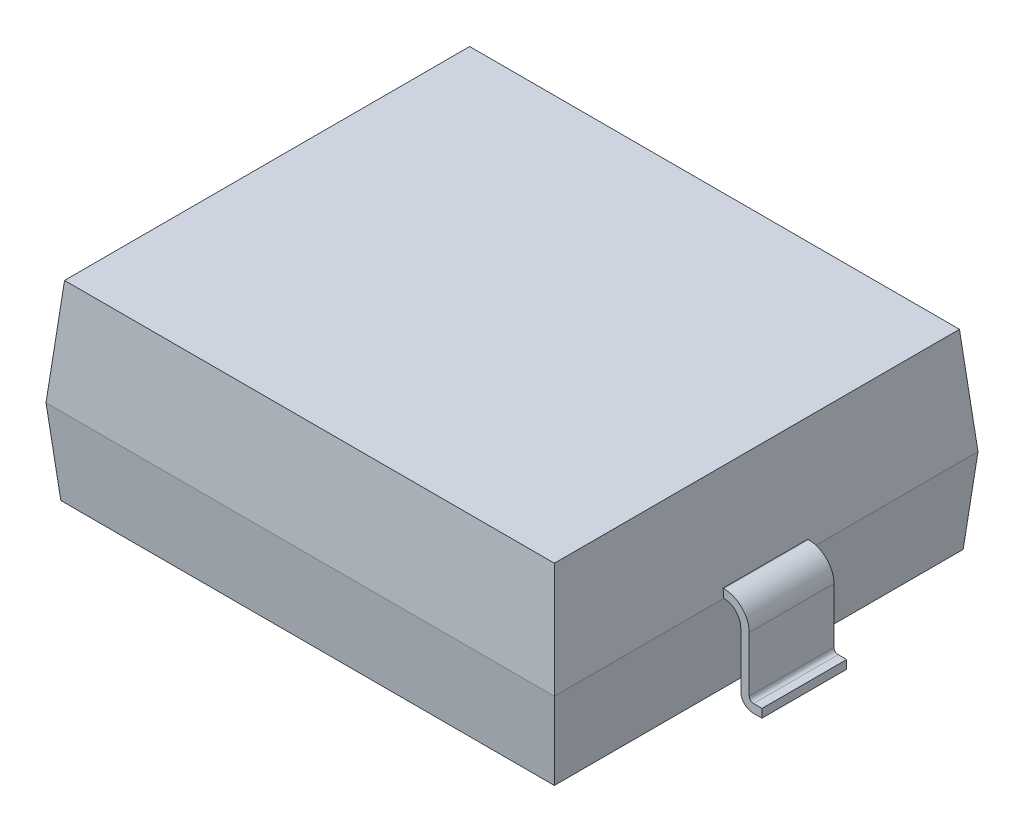
ISO-10303-21;
HEADER;
FILE_DESCRIPTION(('STEP AP214'),'2;1');
FILE_NAME('part.step','',(''),(''),'','','');
FILE_SCHEMA(('AUTOMOTIVE_DESIGN { 1 0 10303 214 1 1 1 1 }'));
ENDSEC;
DATA;
#1=APPLICATION_CONTEXT('core data for automotive mechanical design processes');
#2=APPLICATION_PROTOCOL_DEFINITION('international standard','automotive_design',2000,#1);
#3=PRODUCT_CONTEXT('',#1,'mechanical');
#4=PRODUCT('Part','Part','',(#3));
#5=PRODUCT_RELATED_PRODUCT_CATEGORY('part','',(#4));
#6=PRODUCT_DEFINITION_FORMATION('','',#4);
#7=PRODUCT_DEFINITION_CONTEXT('part definition',#1,'design');
#8=PRODUCT_DEFINITION('design','',#6,#7);
#9=PRODUCT_DEFINITION_SHAPE('','',#8);
#10=(LENGTH_UNIT() NAMED_UNIT(*) SI_UNIT(.MILLI.,.METRE.));
#11=(NAMED_UNIT(*) PLANE_ANGLE_UNIT() SI_UNIT($,.RADIAN.));
#12=(NAMED_UNIT(*) SI_UNIT($,.STERADIAN.) SOLID_ANGLE_UNIT());
#13=UNCERTAINTY_MEASURE_WITH_UNIT(LENGTH_MEASURE(1.E-05),#10,'distance_accuracy_value','');
#14=(GEOMETRIC_REPRESENTATION_CONTEXT(3) GLOBAL_UNCERTAINTY_ASSIGNED_CONTEXT((#13)) GLOBAL_UNIT_ASSIGNED_CONTEXT((#10,
#11,#12)) REPRESENTATION_CONTEXT('',''));
#15=CARTESIAN_POINT('',(0.,0.,0.));
#16=DIRECTION('',(0.,0.,1.));
#17=DIRECTION('',(1.,0.,0.));
#18=AXIS2_PLACEMENT_3D('',#15,#16,#17);
#19=CARTESIAN_POINT('',(3.,0.,-0.5));
#20=DIRECTION('',(0.,-1.,0.));
#21=DIRECTION('',(0.,0.,-1.));
#22=AXIS2_PLACEMENT_3D('',#19,#20,#21);
#23=PLANE('',#22);
#24=DIRECTION('',(0.,0.,1.));
#25=VECTOR('',#24,1.);
#26=CARTESIAN_POINT('',(1.57301780245438,0.,-0.5));
#27=LINE('',#26,#25);
#28=CARTESIAN_POINT('',(1.57301780245438,0.,-0.5));
#29=VERTEX_POINT('',#28);
#30=CARTESIAN_POINT('',(1.57301780245438,0.,0.5));
#31=VERTEX_POINT('',#30);
#32=EDGE_CURVE('E53',#29,#31,#27,.T.);
#33=ORIENTED_EDGE('',*,*,#32,.F.);
#34=DIRECTION('',(-1.,0.,0.));
#35=VECTOR('',#34,1.);
#36=CARTESIAN_POINT('',(3.,0.,-0.5));
#37=LINE('',#36,#35);
#38=CARTESIAN_POINT('',(3.,0.,-0.5));
#39=VERTEX_POINT('',#38);
#40=EDGE_CURVE('E223',#39,#29,#37,.T.);
#41=ORIENTED_EDGE('',*,*,#40,.F.);
#42=DIRECTION('',(0.,0.,1.));
#43=VECTOR('',#42,1.);
#44=CARTESIAN_POINT('',(3.,0.,-0.5));
#45=LINE('',#44,#43);
#46=CARTESIAN_POINT('',(3.,0.,0.5));
#47=VERTEX_POINT('',#46);
#48=EDGE_CURVE('E12',#39,#47,#45,.T.);
#49=ORIENTED_EDGE('',*,*,#48,.T.);
#50=DIRECTION('',(-1.,0.,0.));
#51=VECTOR('',#50,1.);
#52=CARTESIAN_POINT('',(3.,0.,0.5));
#53=LINE('',#52,#51);
#54=EDGE_CURVE('E144',#47,#31,#53,.T.);
#55=ORIENTED_EDGE('',*,*,#54,.T.);
#56=EDGE_LOOP('',(#33,#41,#49,#55));
#57=FACE_BOUND('',#56,.T.);
#58=ADVANCED_FACE('F50',(#57),#23,.T.);
#59=CARTESIAN_POINT('',(3.,-0.2,-0.5));
#60=DIRECTION('',(0.,0.,1.));
#61=DIRECTION('',(-1.,0.,0.));
#62=AXIS2_PLACEMENT_3D('',#59,#60,#61);
#63=CYLINDRICAL_SURFACE('',#62,0.2);
#64=ORIENTED_EDGE('',*,*,#48,.F.);
#65=CARTESIAN_POINT('',(3.,-0.2,-0.5));
#66=DIRECTION('',(0.,0.,1.));
#67=DIRECTION('',(-1.,0.,0.));
#68=AXIS2_PLACEMENT_3D('',#65,#66,#67);
#69=CIRCLE('',#68,0.2);
#70=CARTESIAN_POINT('',(3.2,-0.2,-0.5));
#71=VERTEX_POINT('',#70);
#72=EDGE_CURVE('E66',#71,#39,#69,.T.);
#73=ORIENTED_EDGE('',*,*,#72,.F.);
#74=DIRECTION('',(0.,0.,1.));
#75=VECTOR('',#74,1.);
#76=CARTESIAN_POINT('',(3.2,-0.2,-0.5));
#77=LINE('',#76,#75);
#78=CARTESIAN_POINT('',(3.2,-0.2,0.5));
#79=VERTEX_POINT('',#78);
#80=EDGE_CURVE('E58',#71,#79,#77,.T.);
#81=ORIENTED_EDGE('',*,*,#80,.T.);
#82=CARTESIAN_POINT('',(3.,-0.2,0.5));
#83=DIRECTION('',(0.,0.,1.));
#84=DIRECTION('',(-1.,0.,0.));
#85=AXIS2_PLACEMENT_3D('',#82,#83,#84);
#86=CIRCLE('',#85,0.2);
#87=EDGE_CURVE('E221',#79,#47,#86,.T.);
#88=ORIENTED_EDGE('',*,*,#87,.T.);
#89=EDGE_LOOP('',(#64,#73,#81,#88));
#90=FACE_BOUND('',#89,.T.);
#91=ADVANCED_FACE('F253',(#90),#63,.F.);
#92=CARTESIAN_POINT('',(3.2,-0.2,-0.5));
#93=DIRECTION('',(-1.,0.,0.));
#94=DIRECTION('',(0.,0.,-1.));
#95=AXIS2_PLACEMENT_3D('',#92,#93,#94);
#96=PLANE('',#95);
#97=ORIENTED_EDGE('',*,*,#80,.F.);
#98=DIRECTION('',(0.,1.,0.));
#99=VECTOR('',#98,1.);
#100=CARTESIAN_POINT('',(3.2,-0.2,-0.5));
#101=LINE('',#100,#99);
#102=CARTESIAN_POINT('',(3.2,-0.85,-0.5));
#103=VERTEX_POINT('',#102);
#104=EDGE_CURVE('E71',#103,#71,#101,.T.);
#105=ORIENTED_EDGE('',*,*,#104,.F.);
#106=DIRECTION('',(0.,0.,1.));
#107=VECTOR('',#106,1.);
#108=CARTESIAN_POINT('',(3.2,-0.85,-0.5));
#109=LINE('',#108,#107);
#110=CARTESIAN_POINT('',(3.2,-0.85,0.5));
#111=VERTEX_POINT('',#110);
#112=EDGE_CURVE('E167',#103,#111,#109,.T.);
#113=ORIENTED_EDGE('',*,*,#112,.T.);
#114=DIRECTION('',(0.,1.,0.));
#115=VECTOR('',#114,1.);
#116=CARTESIAN_POINT('',(3.2,-0.2,0.5));
#117=LINE('',#116,#115);
#118=EDGE_CURVE('E219',#111,#79,#117,.T.);
#119=ORIENTED_EDGE('',*,*,#118,.T.);
#120=EDGE_LOOP('',(#97,#105,#113,#119));
#121=FACE_BOUND('',#120,.T.);
#122=ADVANCED_FACE('F251',(#121),#96,.T.);
#123=CARTESIAN_POINT('',(3.35,-0.85,-0.5));
#124=DIRECTION('',(0.,0.,1.));
#125=DIRECTION('',(-1.,0.,0.));
#126=AXIS2_PLACEMENT_3D('',#123,#124,#125);
#127=CYLINDRICAL_SURFACE('',#126,0.15);
#128=ORIENTED_EDGE('',*,*,#112,.F.);
#129=CARTESIAN_POINT('',(3.35,-0.85,-0.5));
#130=DIRECTION('',(0.,0.,-1.));
#131=DIRECTION('',(1.,0.,0.));
#132=AXIS2_PLACEMENT_3D('',#129,#130,#131);
#133=CIRCLE('',#132,0.15);
#134=CARTESIAN_POINT('',(3.35,-1.,-0.5));
#135=VERTEX_POINT('',#134);
#136=EDGE_CURVE('E161',#135,#103,#133,.T.);
#137=ORIENTED_EDGE('',*,*,#136,.F.);
#138=DIRECTION('',(0.,0.,1.));
#139=VECTOR('',#138,1.);
#140=CARTESIAN_POINT('',(3.35,-1.,-0.5));
#141=LINE('',#140,#139);
#142=CARTESIAN_POINT('',(3.35,-1.,0.5));
#143=VERTEX_POINT('',#142);
#144=EDGE_CURVE('E170',#135,#143,#141,.T.);
#145=ORIENTED_EDGE('',*,*,#144,.T.);
#146=CARTESIAN_POINT('',(3.35,-0.85,0.5));
#147=DIRECTION('',(0.,0.,-1.));
#148=DIRECTION('',(1.,0.,0.));
#149=AXIS2_PLACEMENT_3D('',#146,#147,#148);
#150=CIRCLE('',#149,0.15);
#151=EDGE_CURVE('E217',#143,#111,#150,.T.);
#152=ORIENTED_EDGE('',*,*,#151,.T.);
#153=EDGE_LOOP('',(#128,#137,#145,#152));
#154=FACE_BOUND('',#153,.T.);
#155=ADVANCED_FACE('F247',(#154),#127,.T.);
#156=CARTESIAN_POINT('',(3.35,-1.,-0.5));
#157=DIRECTION('',(0.,-1.,0.));
#158=DIRECTION('',(0.,0.,-1.));
#159=AXIS2_PLACEMENT_3D('',#156,#157,#158);
#160=PLANE('',#159);
#161=ORIENTED_EDGE('',*,*,#144,.F.);
#162=DIRECTION('',(-1.,0.,0.));
#163=VECTOR('',#162,1.);
#164=CARTESIAN_POINT('',(3.35,-1.,-0.5));
#165=LINE('',#164,#163);
#166=CARTESIAN_POINT('',(3.45,-1.,-0.5));
#167=VERTEX_POINT('',#166);
#168=EDGE_CURVE('E240',#167,#135,#165,.T.);
#169=ORIENTED_EDGE('',*,*,#168,.F.);
#170=DIRECTION('',(0.,0.,1.));
#171=VECTOR('',#170,1.);
#172=CARTESIAN_POINT('',(3.45,-1.,-0.5));
#173=LINE('',#172,#171);
#174=CARTESIAN_POINT('',(3.45,-1.,0.5));
#175=VERTEX_POINT('',#174);
#176=EDGE_CURVE('E173',#167,#175,#173,.T.);
#177=ORIENTED_EDGE('',*,*,#176,.T.);
#178=DIRECTION('',(-1.,0.,0.));
#179=VECTOR('',#178,1.);
#180=CARTESIAN_POINT('',(3.35,-1.,0.5));
#181=LINE('',#180,#179);
#182=EDGE_CURVE('E215',#175,#143,#181,.T.);
#183=ORIENTED_EDGE('',*,*,#182,.T.);
#184=EDGE_LOOP('',(#161,#169,#177,#183));
#185=FACE_BOUND('',#184,.T.);
#186=ADVANCED_FACE('F268',(#185),#160,.T.);
#187=CARTESIAN_POINT('',(3.45,-1.,-0.5));
#188=DIRECTION('',(-1.,0.,0.));
#189=DIRECTION('',(0.,0.,-1.));
#190=AXIS2_PLACEMENT_3D('',#187,#188,#189);
#191=PLANE('',#190);
#192=ORIENTED_EDGE('',*,*,#176,.F.);
#193=DIRECTION('',(0.,1.,0.));
#194=VECTOR('',#193,1.);
#195=CARTESIAN_POINT('',(3.45,-1.,-0.5));
#196=LINE('',#195,#194);
#197=CARTESIAN_POINT('',(3.45,-0.9,-0.5));
#198=VERTEX_POINT('',#197);
#199=EDGE_CURVE('E237',#167,#198,#196,.T.);
#200=ORIENTED_EDGE('',*,*,#199,.T.);
#201=DIRECTION('',(0.,0.,1.));
#202=VECTOR('',#201,1.);
#203=CARTESIAN_POINT('',(3.45,-0.9,-0.5));
#204=LINE('',#203,#202);
#205=CARTESIAN_POINT('',(3.45,-0.9,0.5));
#206=VERTEX_POINT('',#205);
#207=EDGE_CURVE('E176',#198,#206,#204,.T.);
#208=ORIENTED_EDGE('',*,*,#207,.T.);
#209=DIRECTION('',(0.,1.,0.));
#210=VECTOR('',#209,1.);
#211=CARTESIAN_POINT('',(3.45,-1.,0.5));
#212=LINE('',#211,#210);
#213=EDGE_CURVE('E212',#175,#206,#212,.T.);
#214=ORIENTED_EDGE('',*,*,#213,.F.);
#215=EDGE_LOOP('',(#192,#200,#208,#214));
#216=FACE_BOUND('',#215,.T.);
#217=ADVANCED_FACE('F265',(#216),#191,.F.);
#218=CARTESIAN_POINT('',(3.35,-0.9,-0.5));
#219=DIRECTION('',(0.,-1.,0.));
#220=DIRECTION('',(0.,0.,-1.));
#221=AXIS2_PLACEMENT_3D('',#218,#219,#220);
#222=PLANE('',#221);
#223=ORIENTED_EDGE('',*,*,#207,.F.);
#224=DIRECTION('',(-1.,0.,0.));
#225=VECTOR('',#224,1.);
#226=CARTESIAN_POINT('',(3.35,-0.9,-0.5));
#227=LINE('',#226,#225);
#228=CARTESIAN_POINT('',(3.35,-0.9,-0.5));
#229=VERTEX_POINT('',#228);
#230=EDGE_CURVE('E234',#198,#229,#227,.T.);
#231=ORIENTED_EDGE('',*,*,#230,.T.);
#232=DIRECTION('',(0.,0.,1.));
#233=VECTOR('',#232,1.);
#234=CARTESIAN_POINT('',(3.35,-0.9,-0.5));
#235=LINE('',#234,#233);
#236=CARTESIAN_POINT('',(3.35,-0.9,0.5));
#237=VERTEX_POINT('',#236);
#238=EDGE_CURVE('E179',#229,#237,#235,.T.);
#239=ORIENTED_EDGE('',*,*,#238,.T.);
#240=DIRECTION('',(-1.,0.,0.));
#241=VECTOR('',#240,1.);
#242=CARTESIAN_POINT('',(3.35,-0.9,0.5));
#243=LINE('',#242,#241);
#244=EDGE_CURVE('E209',#206,#237,#243,.T.);
#245=ORIENTED_EDGE('',*,*,#244,.F.);
#246=EDGE_LOOP('',(#223,#231,#239,#245));
#247=FACE_BOUND('',#246,.T.);
#248=ADVANCED_FACE('F263',(#247),#222,.F.);
#249=CARTESIAN_POINT('',(3.35,-0.85,-0.5));
#250=DIRECTION('',(0.,0.,1.));
#251=DIRECTION('',(-1.,0.,0.));
#252=AXIS2_PLACEMENT_3D('',#249,#250,#251);
#253=CYLINDRICAL_SURFACE('',#252,0.05);
#254=ORIENTED_EDGE('',*,*,#238,.F.);
#255=CARTESIAN_POINT('',(3.35,-0.85,-0.5));
#256=DIRECTION('',(0.,0.,-1.));
#257=DIRECTION('',(-1.,0.,0.));
#258=AXIS2_PLACEMENT_3D('',#255,#256,#257);
#259=CIRCLE('',#258,0.05);
#260=CARTESIAN_POINT('',(3.3,-0.85,-0.5));
#261=VERTEX_POINT('',#260);
#262=EDGE_CURVE('E231',#229,#261,#259,.T.);
#263=ORIENTED_EDGE('',*,*,#262,.T.);
#264=DIRECTION('',(0.,0.,1.));
#265=VECTOR('',#264,1.);
#266=CARTESIAN_POINT('',(3.3,-0.85,-0.5));
#267=LINE('',#266,#265);
#268=CARTESIAN_POINT('',(3.3,-0.85,0.5));
#269=VERTEX_POINT('',#268);
#270=EDGE_CURVE('E182',#261,#269,#267,.T.);
#271=ORIENTED_EDGE('',*,*,#270,.T.);
#272=CARTESIAN_POINT('',(3.35,-0.85,0.5));
#273=DIRECTION('',(0.,0.,-1.));
#274=DIRECTION('',(-1.,0.,0.));
#275=AXIS2_PLACEMENT_3D('',#272,#273,#274);
#276=CIRCLE('',#275,0.05);
#277=EDGE_CURVE('E205',#237,#269,#276,.T.);
#278=ORIENTED_EDGE('',*,*,#277,.F.);
#279=EDGE_LOOP('',(#254,#263,#271,#278));
#280=FACE_BOUND('',#279,.T.);
#281=ADVANCED_FACE('F259',(#280),#253,.F.);
#282=CARTESIAN_POINT('',(3.3,-0.2,-0.5));
#283=DIRECTION('',(-1.,0.,0.));
#284=DIRECTION('',(0.,0.,-1.));
#285=AXIS2_PLACEMENT_3D('',#282,#283,#284);
#286=PLANE('',#285);
#287=ORIENTED_EDGE('',*,*,#270,.F.);
#288=DIRECTION('',(0.,1.,0.));
#289=VECTOR('',#288,1.);
#290=CARTESIAN_POINT('',(3.3,-0.2,-0.5));
#291=LINE('',#290,#289);
#292=CARTESIAN_POINT('',(3.3,-0.2,-0.5));
#293=VERTEX_POINT('',#292);
#294=EDGE_CURVE('E228',#261,#293,#291,.T.);
#295=ORIENTED_EDGE('',*,*,#294,.T.);
#296=DIRECTION('',(0.,0.,1.));
#297=VECTOR('',#296,1.);
#298=CARTESIAN_POINT('',(3.3,-0.2,-0.5));
#299=LINE('',#298,#297);
#300=CARTESIAN_POINT('',(3.3,-0.2,0.5));
#301=VERTEX_POINT('',#300);
#302=EDGE_CURVE('E185',#293,#301,#299,.T.);
#303=ORIENTED_EDGE('',*,*,#302,.T.);
#304=DIRECTION('',(0.,1.,0.));
#305=VECTOR('',#304,1.);
#306=CARTESIAN_POINT('',(3.3,-0.2,0.5));
#307=LINE('',#306,#305);
#308=EDGE_CURVE('E203',#269,#301,#307,.T.);
#309=ORIENTED_EDGE('',*,*,#308,.F.);
#310=EDGE_LOOP('',(#287,#295,#303,#309));
#311=FACE_BOUND('',#310,.T.);
#312=ADVANCED_FACE('F256',(#311),#286,.F.);
#313=CARTESIAN_POINT('',(3.,-0.2,-0.5));
#314=DIRECTION('',(0.,0.,1.));
#315=DIRECTION('',(-1.,0.,0.));
#316=AXIS2_PLACEMENT_3D('',#313,#314,#315);
#317=CYLINDRICAL_SURFACE('',#316,0.3);
#318=ORIENTED_EDGE('',*,*,#302,.F.);
#319=CARTESIAN_POINT('',(3.,-0.2,-0.5));
#320=DIRECTION('',(0.,0.,-1.));
#321=DIRECTION('',(-1.,0.,0.));
#322=AXIS2_PLACEMENT_3D('',#319,#320,#321);
#323=CIRCLE('',#322,0.3);
#324=CARTESIAN_POINT('',(3.,0.1,-0.5));
#325=VERTEX_POINT('',#324);
#326=EDGE_CURVE('E196',#293,#325,#323,.F.);
#327=ORIENTED_EDGE('',*,*,#326,.T.);
#328=DIRECTION('',(0.,0.,1.));
#329=VECTOR('',#328,1.);
#330=CARTESIAN_POINT('',(3.,0.1,-0.5));
#331=LINE('',#330,#329);
#332=CARTESIAN_POINT('',(3.,0.1,0.5));
#333=VERTEX_POINT('',#332);
#334=EDGE_CURVE('E159',#325,#333,#331,.T.);
#335=ORIENTED_EDGE('',*,*,#334,.T.);
#336=CARTESIAN_POINT('',(3.,-0.2,0.5));
#337=DIRECTION('',(0.,0.,-1.));
#338=DIRECTION('',(-1.,0.,0.));
#339=AXIS2_PLACEMENT_3D('',#336,#337,#338);
#340=CIRCLE('',#339,0.3);
#341=EDGE_CURVE('E194',#301,#333,#340,.F.);
#342=ORIENTED_EDGE('',*,*,#341,.F.);
#343=EDGE_LOOP('',(#318,#327,#335,#342));
#344=FACE_BOUND('',#343,.T.);
#345=ADVANCED_FACE('F193',(#344),#317,.T.);
#346=CARTESIAN_POINT('',(3.,0.1,-0.5));
#347=DIRECTION('',(0.,-1.,0.));
#348=DIRECTION('',(0.,0.,-1.));
#349=AXIS2_PLACEMENT_3D('',#346,#347,#348);
#350=PLANE('',#349);
#351=ORIENTED_EDGE('',*,*,#334,.F.);
#352=DIRECTION('',(-1.,0.,0.));
#353=VECTOR('',#352,1.);
#354=CARTESIAN_POINT('',(3.,0.1,-0.5));
#355=LINE('',#354,#353);
#356=CARTESIAN_POINT('',(1.57301780245438,0.1,-0.5));
#357=VERTEX_POINT('',#356);
#358=EDGE_CURVE('E200',#325,#357,#355,.T.);
#359=ORIENTED_EDGE('',*,*,#358,.T.);
#360=DIRECTION('',(0.,0.,1.));
#361=VECTOR('',#360,1.);
#362=CARTESIAN_POINT('',(1.57301780245438,0.1,-0.5));
#363=LINE('',#362,#361);
#364=CARTESIAN_POINT('',(1.57301780245438,0.1,0.5));
#365=VERTEX_POINT('',#364);
#366=EDGE_CURVE('E158',#357,#365,#363,.T.);
#367=ORIENTED_EDGE('',*,*,#366,.T.);
#368=DIRECTION('',(-1.,0.,0.));
#369=VECTOR('',#368,1.);
#370=CARTESIAN_POINT('',(3.,0.1,0.5));
#371=LINE('',#370,#369);
#372=EDGE_CURVE('E146',#333,#365,#371,.T.);
#373=ORIENTED_EDGE('',*,*,#372,.F.);
#374=EDGE_LOOP('',(#351,#359,#367,#373));
#375=FACE_BOUND('',#374,.T.);
#376=ADVANCED_FACE('F199',(#375),#350,.F.);
#377=CARTESIAN_POINT('',(1.57301780245438,0.1,-0.5));
#378=DIRECTION('',(1.,0.,0.));
#379=DIRECTION('',(0.,-1.,0.));
#380=AXIS2_PLACEMENT_3D('',#377,#378,#379);
#381=PLANE('',#380);
#382=ORIENTED_EDGE('',*,*,#366,.F.);
#383=DIRECTION('',(0.,-1.,0.));
#384=VECTOR('',#383,1.);
#385=CARTESIAN_POINT('',(1.57301780245438,0.1,-0.5));
#386=LINE('',#385,#384);
#387=EDGE_CURVE('E157',#357,#29,#386,.T.);
#388=ORIENTED_EDGE('',*,*,#387,.T.);
#389=ORIENTED_EDGE('',*,*,#32,.T.);
#390=DIRECTION('',(0.,-1.,0.));
#391=VECTOR('',#390,1.);
#392=CARTESIAN_POINT('',(1.57301780245438,0.1,0.5));
#393=LINE('',#392,#391);
#394=EDGE_CURVE('E140',#365,#31,#393,.T.);
#395=ORIENTED_EDGE('',*,*,#394,.F.);
#396=EDGE_LOOP('',(#382,#388,#389,#395));
#397=FACE_BOUND('',#396,.T.);
#398=ADVANCED_FACE('F156',(#397),#381,.F.);
#399=CARTESIAN_POINT('',(3.,-0.2,-0.5));
#400=DIRECTION('',(0.,0.,1.));
#401=DIRECTION('',(-1.,0.,0.));
#402=AXIS2_PLACEMENT_3D('',#399,#400,#401);
#403=PLANE('',#402);
#404=ORIENTED_EDGE('',*,*,#40,.T.);
#405=ORIENTED_EDGE('',*,*,#387,.F.);
#406=ORIENTED_EDGE('',*,*,#358,.F.);
#407=ORIENTED_EDGE('',*,*,#326,.F.);
#408=ORIENTED_EDGE('',*,*,#294,.F.);
#409=ORIENTED_EDGE('',*,*,#262,.F.);
#410=ORIENTED_EDGE('',*,*,#230,.F.);
#411=ORIENTED_EDGE('',*,*,#199,.F.);
#412=ORIENTED_EDGE('',*,*,#168,.T.);
#413=ORIENTED_EDGE('',*,*,#136,.T.);
#414=ORIENTED_EDGE('',*,*,#104,.T.);
#415=ORIENTED_EDGE('',*,*,#72,.T.);
#416=EDGE_LOOP('',(#404,#405,#406,#407,#408,#409,#410,#411,#412,#413,#414,#415));
#417=FACE_BOUND('',#416,.T.);
#418=ADVANCED_FACE('F243',(#417),#403,.F.);
#419=CARTESIAN_POINT('',(3.,-0.2,0.5));
#420=DIRECTION('',(0.,0.,1.));
#421=DIRECTION('',(-1.,0.,0.));
#422=AXIS2_PLACEMENT_3D('',#419,#420,#421);
#423=PLANE('',#422);
#424=ORIENTED_EDGE('',*,*,#54,.F.);
#425=ORIENTED_EDGE('',*,*,#87,.F.);
#426=ORIENTED_EDGE('',*,*,#118,.F.);
#427=ORIENTED_EDGE('',*,*,#151,.F.);
#428=ORIENTED_EDGE('',*,*,#182,.F.);
#429=ORIENTED_EDGE('',*,*,#213,.T.);
#430=ORIENTED_EDGE('',*,*,#244,.T.);
#431=ORIENTED_EDGE('',*,*,#277,.T.);
#432=ORIENTED_EDGE('',*,*,#308,.T.);
#433=ORIENTED_EDGE('',*,*,#341,.T.);
#434=ORIENTED_EDGE('',*,*,#372,.T.);
#435=ORIENTED_EDGE('',*,*,#394,.T.);
#436=EDGE_LOOP('',(#424,#425,#426,#427,#428,#429,#430,#431,#432,#433,#434,#435));
#437=FACE_BOUND('',#436,.T.);
#438=ADVANCED_FACE('F142',(#437),#423,.T.);
#439=CLOSED_SHELL('',(#58,#91,#122,#155,#186,#217,#248,#281,#312,#345,#376,#398,#418,#438));
#440=MANIFOLD_SOLID_BREP('B2',#439);
#441=CARTESIAN_POINT('',(-3.,0.,-0.5));
#442=DIRECTION('',(0.,-1.,0.));
#443=DIRECTION('',(0.,0.,-1.));
#444=AXIS2_PLACEMENT_3D('',#441,#442,#443);
#445=PLANE('',#444);
#446=DIRECTION('',(0.,0.,1.));
#447=VECTOR('',#446,1.);
#448=CARTESIAN_POINT('',(-1.57301780245438,0.,-0.5));
#449=LINE('',#448,#447);
#450=CARTESIAN_POINT('',(-1.57301780245438,0.,-0.5));
#451=VERTEX_POINT('',#450);
#452=CARTESIAN_POINT('',(-1.57301780245438,0.,0.5));
#453=VERTEX_POINT('',#452);
#454=EDGE_CURVE('E424',#451,#453,#449,.T.);
#455=ORIENTED_EDGE('',*,*,#454,.T.);
#456=DIRECTION('',(1.,0.,0.));
#457=VECTOR('',#456,1.);
#458=CARTESIAN_POINT('',(-3.,0.,0.5));
#459=LINE('',#458,#457);
#460=CARTESIAN_POINT('',(-3.,0.,0.5));
#461=VERTEX_POINT('',#460);
#462=EDGE_CURVE('E509',#461,#453,#459,.T.);
#463=ORIENTED_EDGE('',*,*,#462,.F.);
#464=DIRECTION('',(0.,0.,1.));
#465=VECTOR('',#464,1.);
#466=CARTESIAN_POINT('',(-3.,0.,-0.5));
#467=LINE('',#466,#465);
#468=CARTESIAN_POINT('',(-3.,0.,-0.5));
#469=VERTEX_POINT('',#468);
#470=EDGE_CURVE('E48',#469,#461,#467,.T.);
#471=ORIENTED_EDGE('',*,*,#470,.F.);
#472=DIRECTION('',(1.,0.,0.));
#473=VECTOR('',#472,1.);
#474=CARTESIAN_POINT('',(-3.,0.,-0.5));
#475=LINE('',#474,#473);
#476=EDGE_CURVE('E510',#469,#451,#475,.T.);
#477=ORIENTED_EDGE('',*,*,#476,.T.);
#478=EDGE_LOOP('',(#455,#463,#471,#477));
#479=FACE_BOUND('',#478,.T.);
#480=ADVANCED_FACE('F421',(#479),#445,.T.);
#481=CARTESIAN_POINT('',(-3.,-0.2,-0.5));
#482=DIRECTION('',(0.,0.,1.));
#483=DIRECTION('',(1.,0.,0.));
#484=AXIS2_PLACEMENT_3D('',#481,#482,#483);
#485=CYLINDRICAL_SURFACE('',#484,0.2);
#486=ORIENTED_EDGE('',*,*,#470,.T.);
#487=CARTESIAN_POINT('',(-3.,-0.2,0.5));
#488=DIRECTION('',(0.,0.,-1.));
#489=DIRECTION('',(1.,0.,0.));
#490=AXIS2_PLACEMENT_3D('',#487,#488,#489);
#491=CIRCLE('',#490,0.2);
#492=CARTESIAN_POINT('',(-3.2,-0.2,0.5));
#493=VERTEX_POINT('',#492);
#494=EDGE_CURVE('E524',#493,#461,#491,.T.);
#495=ORIENTED_EDGE('',*,*,#494,.F.);
#496=DIRECTION('',(0.,0.,1.));
#497=VECTOR('',#496,1.);
#498=CARTESIAN_POINT('',(-3.2,-0.2,-0.5));
#499=LINE('',#498,#497);
#500=CARTESIAN_POINT('',(-3.2,-0.2,-0.5));
#501=VERTEX_POINT('',#500);
#502=EDGE_CURVE('E429',#501,#493,#499,.T.);
#503=ORIENTED_EDGE('',*,*,#502,.F.);
#504=CARTESIAN_POINT('',(-3.,-0.2,-0.5));
#505=DIRECTION('',(0.,0.,-1.));
#506=DIRECTION('',(1.,0.,0.));
#507=AXIS2_PLACEMENT_3D('',#504,#505,#506);
#508=CIRCLE('',#507,0.2);
#509=EDGE_CURVE('E515',#501,#469,#508,.T.);
#510=ORIENTED_EDGE('',*,*,#509,.T.);
#511=EDGE_LOOP('',(#486,#495,#503,#510));
#512=FACE_BOUND('',#511,.T.);
#513=ADVANCED_FACE('F639',(#512),#485,.F.);
#514=CARTESIAN_POINT('',(-3.2,-0.2,-0.5));
#515=DIRECTION('',(1.,0.,0.));
#516=DIRECTION('',(0.,0.,-1.));
#517=AXIS2_PLACEMENT_3D('',#514,#515,#516);
#518=PLANE('',#517);
#519=ORIENTED_EDGE('',*,*,#502,.T.);
#520=DIRECTION('',(0.,1.,0.));
#521=VECTOR('',#520,1.);
#522=CARTESIAN_POINT('',(-3.2,-0.2,0.5));
#523=LINE('',#522,#521);
#524=CARTESIAN_POINT('',(-3.2,-0.85,0.5));
#525=VERTEX_POINT('',#524);
#526=EDGE_CURVE('E553',#525,#493,#523,.T.);
#527=ORIENTED_EDGE('',*,*,#526,.F.);
#528=DIRECTION('',(0.,0.,1.));
#529=VECTOR('',#528,1.);
#530=CARTESIAN_POINT('',(-3.2,-0.85,-0.5));
#531=LINE('',#530,#529);
#532=CARTESIAN_POINT('',(-3.2,-0.85,-0.5));
#533=VERTEX_POINT('',#532);
#534=EDGE_CURVE('E581',#533,#525,#531,.T.);
#535=ORIENTED_EDGE('',*,*,#534,.F.);
#536=DIRECTION('',(0.,1.,0.));
#537=VECTOR('',#536,1.);
#538=CARTESIAN_POINT('',(-3.2,-0.2,-0.5));
#539=LINE('',#538,#537);
#540=EDGE_CURVE('E577',#533,#501,#539,.T.);
#541=ORIENTED_EDGE('',*,*,#540,.T.);
#542=EDGE_LOOP('',(#519,#527,#535,#541));
#543=FACE_BOUND('',#542,.T.);
#544=ADVANCED_FACE('F635',(#543),#518,.T.);
#545=CARTESIAN_POINT('',(-3.35,-0.85,-0.5));
#546=DIRECTION('',(0.,0.,1.));
#547=DIRECTION('',(1.,0.,0.));
#548=AXIS2_PLACEMENT_3D('',#545,#546,#547);
#549=CYLINDRICAL_SURFACE('',#548,0.15);
#550=ORIENTED_EDGE('',*,*,#534,.T.);
#551=CARTESIAN_POINT('',(-3.35,-0.85,0.5));
#552=DIRECTION('',(0.,0.,1.));
#553=DIRECTION('',(-1.,0.,0.));
#554=AXIS2_PLACEMENT_3D('',#551,#552,#553);
#555=CIRCLE('',#554,0.15);
#556=CARTESIAN_POINT('',(-3.35,-1.,0.5));
#557=VERTEX_POINT('',#556);
#558=EDGE_CURVE('E550',#557,#525,#555,.T.);
#559=ORIENTED_EDGE('',*,*,#558,.F.);
#560=DIRECTION('',(0.,0.,1.));
#561=VECTOR('',#560,1.);
#562=CARTESIAN_POINT('',(-3.35,-1.,-0.5));
#563=LINE('',#562,#561);
#564=CARTESIAN_POINT('',(-3.35,-1.,-0.5));
#565=VERTEX_POINT('',#564);
#566=EDGE_CURVE('E583',#565,#557,#563,.T.);
#567=ORIENTED_EDGE('',*,*,#566,.F.);
#568=CARTESIAN_POINT('',(-3.35,-0.85,-0.5));
#569=DIRECTION('',(0.,0.,1.));
#570=DIRECTION('',(-1.,0.,0.));
#571=AXIS2_PLACEMENT_3D('',#568,#569,#570);
#572=CIRCLE('',#571,0.15);
#573=EDGE_CURVE('E574',#565,#533,#572,.T.);
#574=ORIENTED_EDGE('',*,*,#573,.T.);
#575=EDGE_LOOP('',(#550,#559,#567,#574));
#576=FACE_BOUND('',#575,.T.);
#577=ADVANCED_FACE('F631',(#576),#549,.T.);
#578=CARTESIAN_POINT('',(-3.35,-1.,-0.5));
#579=DIRECTION('',(0.,-1.,0.));
#580=DIRECTION('',(0.,0.,-1.));
#581=AXIS2_PLACEMENT_3D('',#578,#579,#580);
#582=PLANE('',#581);
#583=ORIENTED_EDGE('',*,*,#566,.T.);
#584=DIRECTION('',(1.,0.,0.));
#585=VECTOR('',#584,1.);
#586=CARTESIAN_POINT('',(-3.35,-1.,0.5));
#587=LINE('',#586,#585);
#588=CARTESIAN_POINT('',(-3.45,-1.,0.5));
#589=VERTEX_POINT('',#588);
#590=EDGE_CURVE('E547',#589,#557,#587,.T.);
#591=ORIENTED_EDGE('',*,*,#590,.F.);
#592=DIRECTION('',(0.,0.,1.));
#593=VECTOR('',#592,1.);
#594=CARTESIAN_POINT('',(-3.45,-1.,-0.5));
#595=LINE('',#594,#593);
#596=CARTESIAN_POINT('',(-3.45,-1.,-0.5));
#597=VERTEX_POINT('',#596);
#598=EDGE_CURVE('E585',#597,#589,#595,.T.);
#599=ORIENTED_EDGE('',*,*,#598,.F.);
#600=DIRECTION('',(1.,0.,0.));
#601=VECTOR('',#600,1.);
#602=CARTESIAN_POINT('',(-3.35,-1.,-0.5));
#603=LINE('',#602,#601);
#604=EDGE_CURVE('E571',#597,#565,#603,.T.);
#605=ORIENTED_EDGE('',*,*,#604,.T.);
#606=EDGE_LOOP('',(#583,#591,#599,#605));
#607=FACE_BOUND('',#606,.T.);
#608=ADVANCED_FACE('F627',(#607),#582,.T.);
#609=CARTESIAN_POINT('',(-3.45,-1.,-0.5));
#610=DIRECTION('',(1.,0.,0.));
#611=DIRECTION('',(0.,0.,-1.));
#612=AXIS2_PLACEMENT_3D('',#609,#610,#611);
#613=PLANE('',#612);
#614=ORIENTED_EDGE('',*,*,#598,.T.);
#615=DIRECTION('',(0.,1.,0.));
#616=VECTOR('',#615,1.);
#617=CARTESIAN_POINT('',(-3.45,-1.,0.5));
#618=LINE('',#617,#616);
#619=CARTESIAN_POINT('',(-3.45,-0.9,0.5));
#620=VERTEX_POINT('',#619);
#621=EDGE_CURVE('E544',#589,#620,#618,.T.);
#622=ORIENTED_EDGE('',*,*,#621,.T.);
#623=DIRECTION('',(0.,0.,1.));
#624=VECTOR('',#623,1.);
#625=CARTESIAN_POINT('',(-3.45,-0.9,-0.5));
#626=LINE('',#625,#624);
#627=CARTESIAN_POINT('',(-3.45,-0.9,-0.5));
#628=VERTEX_POINT('',#627);
#629=EDGE_CURVE('E587',#628,#620,#626,.T.);
#630=ORIENTED_EDGE('',*,*,#629,.F.);
#631=DIRECTION('',(0.,1.,0.));
#632=VECTOR('',#631,1.);
#633=CARTESIAN_POINT('',(-3.45,-1.,-0.5));
#634=LINE('',#633,#632);
#635=EDGE_CURVE('E569',#597,#628,#634,.T.);
#636=ORIENTED_EDGE('',*,*,#635,.F.);
#637=EDGE_LOOP('',(#614,#622,#630,#636));
#638=FACE_BOUND('',#637,.T.);
#639=ADVANCED_FACE('F622',(#638),#613,.F.);
#640=CARTESIAN_POINT('',(-3.35,-0.9,-0.5));
#641=DIRECTION('',(0.,-1.,0.));
#642=DIRECTION('',(0.,0.,-1.));
#643=AXIS2_PLACEMENT_3D('',#640,#641,#642);
#644=PLANE('',#643);
#645=ORIENTED_EDGE('',*,*,#629,.T.);
#646=DIRECTION('',(1.,0.,0.));
#647=VECTOR('',#646,1.);
#648=CARTESIAN_POINT('',(-3.35,-0.9,0.5));
#649=LINE('',#648,#647);
#650=CARTESIAN_POINT('',(-3.35,-0.9,0.5));
#651=VERTEX_POINT('',#650);
#652=EDGE_CURVE('E541',#620,#651,#649,.T.);
#653=ORIENTED_EDGE('',*,*,#652,.T.);
#654=DIRECTION('',(0.,0.,1.));
#655=VECTOR('',#654,1.);
#656=CARTESIAN_POINT('',(-3.35,-0.9,-0.5));
#657=LINE('',#656,#655);
#658=CARTESIAN_POINT('',(-3.35,-0.9,-0.5));
#659=VERTEX_POINT('',#658);
#660=EDGE_CURVE('E589',#659,#651,#657,.T.);
#661=ORIENTED_EDGE('',*,*,#660,.F.);
#662=DIRECTION('',(1.,0.,0.));
#663=VECTOR('',#662,1.);
#664=CARTESIAN_POINT('',(-3.35,-0.9,-0.5));
#665=LINE('',#664,#663);
#666=EDGE_CURVE('E567',#628,#659,#665,.T.);
#667=ORIENTED_EDGE('',*,*,#666,.F.);
#668=EDGE_LOOP('',(#645,#653,#661,#667));
#669=FACE_BOUND('',#668,.T.);
#670=ADVANCED_FACE('F618',(#669),#644,.F.);
#671=CARTESIAN_POINT('',(-3.35,-0.85,-0.5));
#672=DIRECTION('',(0.,0.,1.));
#673=DIRECTION('',(1.,0.,0.));
#674=AXIS2_PLACEMENT_3D('',#671,#672,#673);
#675=CYLINDRICAL_SURFACE('',#674,0.05);
#676=ORIENTED_EDGE('',*,*,#660,.T.);
#677=CARTESIAN_POINT('',(-3.35,-0.85,0.5));
#678=DIRECTION('',(0.,0.,1.));
#679=DIRECTION('',(1.,0.,0.));
#680=AXIS2_PLACEMENT_3D('',#677,#678,#679);
#681=CIRCLE('',#680,0.05);
#682=CARTESIAN_POINT('',(-3.3,-0.85,0.5));
#683=VERTEX_POINT('',#682);
#684=EDGE_CURVE('E538',#651,#683,#681,.T.);
#685=ORIENTED_EDGE('',*,*,#684,.T.);
#686=DIRECTION('',(0.,0.,1.));
#687=VECTOR('',#686,1.);
#688=CARTESIAN_POINT('',(-3.3,-0.85,-0.5));
#689=LINE('',#688,#687);
#690=CARTESIAN_POINT('',(-3.3,-0.85,-0.5));
#691=VERTEX_POINT('',#690);
#692=EDGE_CURVE('E591',#691,#683,#689,.T.);
#693=ORIENTED_EDGE('',*,*,#692,.F.);
#694=CARTESIAN_POINT('',(-3.35,-0.85,-0.5));
#695=DIRECTION('',(0.,0.,1.));
#696=DIRECTION('',(1.,0.,0.));
#697=AXIS2_PLACEMENT_3D('',#694,#695,#696);
#698=CIRCLE('',#697,0.05);
#699=EDGE_CURVE('E565',#659,#691,#698,.T.);
#700=ORIENTED_EDGE('',*,*,#699,.F.);
#701=EDGE_LOOP('',(#676,#685,#693,#700));
#702=FACE_BOUND('',#701,.T.);
#703=ADVANCED_FACE('F613',(#702),#675,.F.);
#704=CARTESIAN_POINT('',(-3.3,-0.2,-0.5));
#705=DIRECTION('',(1.,0.,0.));
#706=DIRECTION('',(0.,0.,-1.));
#707=AXIS2_PLACEMENT_3D('',#704,#705,#706);
#708=PLANE('',#707);
#709=ORIENTED_EDGE('',*,*,#692,.T.);
#710=DIRECTION('',(0.,1.,0.));
#711=VECTOR('',#710,1.);
#712=CARTESIAN_POINT('',(-3.3,-0.2,0.5));
#713=LINE('',#712,#711);
#714=CARTESIAN_POINT('',(-3.3,-0.2,0.5));
#715=VERTEX_POINT('',#714);
#716=EDGE_CURVE('E535',#683,#715,#713,.T.);
#717=ORIENTED_EDGE('',*,*,#716,.T.);
#718=DIRECTION('',(0.,0.,1.));
#719=VECTOR('',#718,1.);
#720=CARTESIAN_POINT('',(-3.3,-0.2,-0.5));
#721=LINE('',#720,#719);
#722=CARTESIAN_POINT('',(-3.3,-0.2,-0.5));
#723=VERTEX_POINT('',#722);
#724=EDGE_CURVE('E593',#723,#715,#721,.T.);
#725=ORIENTED_EDGE('',*,*,#724,.F.);
#726=DIRECTION('',(0.,1.,0.));
#727=VECTOR('',#726,1.);
#728=CARTESIAN_POINT('',(-3.3,-0.2,-0.5));
#729=LINE('',#728,#727);
#730=EDGE_CURVE('E563',#691,#723,#729,.T.);
#731=ORIENTED_EDGE('',*,*,#730,.F.);
#732=EDGE_LOOP('',(#709,#717,#725,#731));
#733=FACE_BOUND('',#732,.T.);
#734=ADVANCED_FACE('F608',(#733),#708,.F.);
#735=CARTESIAN_POINT('',(-3.,-0.2,-0.5));
#736=DIRECTION('',(0.,0.,1.));
#737=DIRECTION('',(1.,0.,0.));
#738=AXIS2_PLACEMENT_3D('',#735,#736,#737);
#739=CYLINDRICAL_SURFACE('',#738,0.3);
#740=ORIENTED_EDGE('',*,*,#724,.T.);
#741=CARTESIAN_POINT('',(-3.,-0.2,0.5));
#742=DIRECTION('',(0.,0.,1.));
#743=DIRECTION('',(1.,0.,0.));
#744=AXIS2_PLACEMENT_3D('',#741,#742,#743);
#745=CIRCLE('',#744,0.3);
#746=CARTESIAN_POINT('',(-3.,0.1,0.5));
#747=VERTEX_POINT('',#746);
#748=EDGE_CURVE('E530',#715,#747,#745,.F.);
#749=ORIENTED_EDGE('',*,*,#748,.T.);
#750=DIRECTION('',(0.,0.,1.));
#751=VECTOR('',#750,1.);
#752=CARTESIAN_POINT('',(-3.,0.1,-0.5));
#753=LINE('',#752,#751);
#754=CARTESIAN_POINT('',(-3.,0.1,-0.5));
#755=VERTEX_POINT('',#754);
#756=EDGE_CURVE('E595',#755,#747,#753,.T.);
#757=ORIENTED_EDGE('',*,*,#756,.F.);
#758=CARTESIAN_POINT('',(-3.,-0.2,-0.5));
#759=DIRECTION('',(0.,0.,1.));
#760=DIRECTION('',(1.,0.,0.));
#761=AXIS2_PLACEMENT_3D('',#758,#759,#760);
#762=CIRCLE('',#761,0.3);
#763=EDGE_CURVE('E561',#723,#755,#762,.F.);
#764=ORIENTED_EDGE('',*,*,#763,.F.);
#765=EDGE_LOOP('',(#740,#749,#757,#764));
#766=FACE_BOUND('',#765,.T.);
#767=ADVANCED_FACE('F604',(#766),#739,.T.);
#768=CARTESIAN_POINT('',(-3.,0.1,-0.5));
#769=DIRECTION('',(0.,-1.,0.));
#770=DIRECTION('',(0.,0.,-1.));
#771=AXIS2_PLACEMENT_3D('',#768,#769,#770);
#772=PLANE('',#771);
#773=ORIENTED_EDGE('',*,*,#756,.T.);
#774=DIRECTION('',(1.,0.,0.));
#775=VECTOR('',#774,1.);
#776=CARTESIAN_POINT('',(-3.,0.1,0.5));
#777=LINE('',#776,#775);
#778=CARTESIAN_POINT('',(-1.57301780245438,0.1,0.5));
#779=VERTEX_POINT('',#778);
#780=EDGE_CURVE('E528',#747,#779,#777,.T.);
#781=ORIENTED_EDGE('',*,*,#780,.T.);
#782=DIRECTION('',(0.,0.,1.));
#783=VECTOR('',#782,1.);
#784=CARTESIAN_POINT('',(-1.57301780245438,0.1,-0.5));
#785=LINE('',#784,#783);
#786=CARTESIAN_POINT('',(-1.57301780245438,0.1,-0.5));
#787=VERTEX_POINT('',#786);
#788=EDGE_CURVE('E514',#787,#779,#785,.T.);
#789=ORIENTED_EDGE('',*,*,#788,.F.);
#790=DIRECTION('',(1.,0.,0.));
#791=VECTOR('',#790,1.);
#792=CARTESIAN_POINT('',(-3.,0.1,-0.5));
#793=LINE('',#792,#791);
#794=EDGE_CURVE('E559',#755,#787,#793,.T.);
#795=ORIENTED_EDGE('',*,*,#794,.F.);
#796=EDGE_LOOP('',(#773,#781,#789,#795));
#797=FACE_BOUND('',#796,.T.);
#798=ADVANCED_FACE('F599',(#797),#772,.F.);
#799=CARTESIAN_POINT('',(-1.57301780245438,0.1,-0.5));
#800=DIRECTION('',(-1.,0.,0.));
#801=DIRECTION('',(0.,-1.,0.));
#802=AXIS2_PLACEMENT_3D('',#799,#800,#801);
#803=PLANE('',#802);
#804=ORIENTED_EDGE('',*,*,#788,.T.);
#805=DIRECTION('',(0.,-1.,0.));
#806=VECTOR('',#805,1.);
#807=CARTESIAN_POINT('',(-1.57301780245438,0.1,0.5));
#808=LINE('',#807,#806);
#809=EDGE_CURVE('E521',#779,#453,#808,.T.);
#810=ORIENTED_EDGE('',*,*,#809,.T.);
#811=ORIENTED_EDGE('',*,*,#454,.F.);
#812=DIRECTION('',(0.,-1.,0.));
#813=VECTOR('',#812,1.);
#814=CARTESIAN_POINT('',(-1.57301780245438,0.1,-0.5));
#815=LINE('',#814,#813);
#816=EDGE_CURVE('E557',#787,#451,#815,.T.);
#817=ORIENTED_EDGE('',*,*,#816,.F.);
#818=EDGE_LOOP('',(#804,#810,#811,#817));
#819=FACE_BOUND('',#818,.T.);
#820=ADVANCED_FACE('F526',(#819),#803,.F.);
#821=CARTESIAN_POINT('',(-3.,-0.2,-0.5));
#822=DIRECTION('',(0.,0.,1.));
#823=DIRECTION('',(1.,0.,0.));
#824=AXIS2_PLACEMENT_3D('',#821,#822,#823);
#825=PLANE('',#824);
#826=ORIENTED_EDGE('',*,*,#476,.F.);
#827=ORIENTED_EDGE('',*,*,#509,.F.);
#828=ORIENTED_EDGE('',*,*,#540,.F.);
#829=ORIENTED_EDGE('',*,*,#573,.F.);
#830=ORIENTED_EDGE('',*,*,#604,.F.);
#831=ORIENTED_EDGE('',*,*,#635,.T.);
#832=ORIENTED_EDGE('',*,*,#666,.T.);
#833=ORIENTED_EDGE('',*,*,#699,.T.);
#834=ORIENTED_EDGE('',*,*,#730,.T.);
#835=ORIENTED_EDGE('',*,*,#763,.T.);
#836=ORIENTED_EDGE('',*,*,#794,.T.);
#837=ORIENTED_EDGE('',*,*,#816,.T.);
#838=EDGE_LOOP('',(#826,#827,#828,#829,#830,#831,#832,#833,#834,#835,#836,#837));
#839=FACE_BOUND('',#838,.T.);
#840=ADVANCED_FACE('F638',(#839),#825,.F.);
#841=CARTESIAN_POINT('',(-3.,-0.2,0.5));
#842=DIRECTION('',(0.,0.,1.));
#843=DIRECTION('',(1.,0.,0.));
#844=AXIS2_PLACEMENT_3D('',#841,#842,#843);
#845=PLANE('',#844);
#846=ORIENTED_EDGE('',*,*,#462,.T.);
#847=ORIENTED_EDGE('',*,*,#809,.F.);
#848=ORIENTED_EDGE('',*,*,#780,.F.);
#849=ORIENTED_EDGE('',*,*,#748,.F.);
#850=ORIENTED_EDGE('',*,*,#716,.F.);
#851=ORIENTED_EDGE('',*,*,#684,.F.);
#852=ORIENTED_EDGE('',*,*,#652,.F.);
#853=ORIENTED_EDGE('',*,*,#621,.F.);
#854=ORIENTED_EDGE('',*,*,#590,.T.);
#855=ORIENTED_EDGE('',*,*,#558,.T.);
#856=ORIENTED_EDGE('',*,*,#526,.T.);
#857=ORIENTED_EDGE('',*,*,#494,.T.);
#858=EDGE_LOOP('',(#846,#847,#848,#849,#850,#851,#852,#853,#854,#855,#856,#857));
#859=FACE_BOUND('',#858,.T.);
#860=ADVANCED_FACE('F519',(#859),#845,.T.);
#861=CLOSED_SHELL('',(#480,#513,#544,#577,#608,#639,#670,#703,#734,#767,#798,#820,#840,#860));
#862=MANIFOLD_SOLID_BREP('B6',#861);
#863=CARTESIAN_POINT('',(3.,0.,2.5));
#864=DIRECTION('',(0.996194698091746,-0.0871557427476584,0.));
#865=DIRECTION('',(0.0871557427476584,0.996194698091746,0.));
#866=AXIS2_PLACEMENT_3D('',#863,#864,#865);
#867=PLANE('',#866);
#868=DIRECTION('',(0.,0.,-1.));
#869=VECTOR('',#868,1.);
#870=CARTESIAN_POINT('',(3.,0.,2.5));
#871=LINE('',#870,#869);
#872=CARTESIAN_POINT('',(3.,0.,2.5));
#873=VERTEX_POINT('',#872);
#874=CARTESIAN_POINT('',(3.,0.,-2.5));
#875=VERTEX_POINT('',#874);
#876=EDGE_CURVE('E813',#873,#875,#871,.T.);
#877=ORIENTED_EDGE('',*,*,#876,.F.);
#878=DIRECTION('',(0.0868265938642478,0.992432509138967,0.0868265938642478));
#879=VECTOR('',#878,1.);
#880=CARTESIAN_POINT('',(2.9547668555876,-0.517017206452113,2.4547668555876));
#881=LINE('',#880,#879);
#882=CARTESIAN_POINT('',(2.91251133647408,-1.,2.41251133647408));
#883=VERTEX_POINT('',#882);
#884=EDGE_CURVE('E419',#883,#873,#881,.T.);
#885=ORIENTED_EDGE('',*,*,#884,.F.);
#886=DIRECTION('',(0.,0.,-1.));
#887=VECTOR('',#886,1.);
#888=CARTESIAN_POINT('',(2.91251133647408,-1.,2.5));
#889=LINE('',#888,#887);
#890=CARTESIAN_POINT('',(2.91251133647408,-1.,-2.41251133647408));
#891=VERTEX_POINT('',#890);
#892=EDGE_CURVE('E836',#883,#891,#889,.T.);
#893=ORIENTED_EDGE('',*,*,#892,.T.);
#894=DIRECTION('',(0.0868265938642478,0.992432509138967,-0.0868265938642478));
#895=VECTOR('',#894,1.);
#896=CARTESIAN_POINT('',(2.96230571298966,-0.430847672043427,-2.46230571298967));
#897=LINE('',#896,#895);
#898=EDGE_CURVE('E791',#891,#875,#897,.T.);
#899=ORIENTED_EDGE('',*,*,#898,.T.);
#900=EDGE_LOOP('',(#877,#885,#893,#899));
#901=FACE_BOUND('',#900,.T.);
#902=ADVANCED_FACE('F754',(#901),#867,.T.);
#903=CARTESIAN_POINT('',(-3.,0.,2.5));
#904=DIRECTION('',(0.,-0.0871557427476584,0.996194698091746));
#905=DIRECTION('',(0.,-0.996194698091746,-0.0871557427476584));
#906=AXIS2_PLACEMENT_3D('',#903,#904,#905);
#907=PLANE('',#906);
#908=DIRECTION('',(1.,0.,0.));
#909=VECTOR('',#908,1.);
#910=CARTESIAN_POINT('',(-3.,0.,2.5));
#911=LINE('',#910,#909);
#912=CARTESIAN_POINT('',(-3.,0.,2.5));
#913=VERTEX_POINT('',#912);
#914=EDGE_CURVE('E823',#913,#873,#911,.T.);
#915=ORIENTED_EDGE('',*,*,#914,.F.);
#916=DIRECTION('',(-0.0868265938642478,0.992432509138967,0.0868265938642478));
#917=VECTOR('',#916,1.);
#918=CARTESIAN_POINT('',(-3.,0.,2.5));
#919=LINE('',#918,#917);
#920=CARTESIAN_POINT('',(-2.91251133647408,-1.,2.41251133647408));
#921=VERTEX_POINT('',#920);
#922=EDGE_CURVE('E764',#921,#913,#919,.T.);
#923=ORIENTED_EDGE('',*,*,#922,.F.);
#924=DIRECTION('',(1.,0.,0.));
#925=VECTOR('',#924,1.);
#926=CARTESIAN_POINT('',(-3.,-1.,2.41251133647408));
#927=LINE('',#926,#925);
#928=EDGE_CURVE('E826',#921,#883,#927,.T.);
#929=ORIENTED_EDGE('',*,*,#928,.T.);
#930=ORIENTED_EDGE('',*,*,#884,.T.);
#931=EDGE_LOOP('',(#915,#923,#929,#930));
#932=FACE_BOUND('',#931,.T.);
#933=ADVANCED_FACE('F756',(#932),#907,.T.);
#934=CARTESIAN_POINT('',(-3.,0.,2.5));
#935=DIRECTION('',(-0.996194698091746,-0.0871557427476584,0.));
#936=DIRECTION('',(0.0871557427476584,-0.996194698091746,0.));
#937=AXIS2_PLACEMENT_3D('',#934,#935,#936);
#938=PLANE('',#937);
#939=DIRECTION('',(0.,0.,1.));
#940=VECTOR('',#939,1.);
#941=CARTESIAN_POINT('',(-3.,0.,2.5));
#942=LINE('',#941,#940);
#943=CARTESIAN_POINT('',(-3.,0.,-2.5));
#944=VERTEX_POINT('',#943);
#945=EDGE_CURVE('E837',#944,#913,#942,.T.);
#946=ORIENTED_EDGE('',*,*,#945,.F.);
#947=DIRECTION('',(-0.0868265938642478,0.992432509138967,-0.0868265938642478));
#948=VECTOR('',#947,1.);
#949=CARTESIAN_POINT('',(-3.,0.,-2.5));
#950=LINE('',#949,#948);
#951=CARTESIAN_POINT('',(-2.91251133647408,-1.,-2.41251133647408));
#952=VERTEX_POINT('',#951);
#953=EDGE_CURVE('E784',#952,#944,#950,.T.);
#954=ORIENTED_EDGE('',*,*,#953,.F.);
#955=DIRECTION('',(0.,0.,1.));
#956=VECTOR('',#955,1.);
#957=CARTESIAN_POINT('',(-2.91251133647408,-1.,2.5));
#958=LINE('',#957,#956);
#959=EDGE_CURVE('E863',#952,#921,#958,.T.);
#960=ORIENTED_EDGE('',*,*,#959,.T.);
#961=ORIENTED_EDGE('',*,*,#922,.T.);
#962=EDGE_LOOP('',(#946,#954,#960,#961));
#963=FACE_BOUND('',#962,.T.);
#964=ADVANCED_FACE('F875',(#963),#938,.T.);
#965=CARTESIAN_POINT('',(-3.,0.,-2.5));
#966=DIRECTION('',(0.,-0.0871557427476584,-0.996194698091746));
#967=DIRECTION('',(0.,0.996194698091746,-0.0871557427476584));
#968=AXIS2_PLACEMENT_3D('',#965,#966,#967);
#969=PLANE('',#968);
#970=DIRECTION('',(-1.,0.,0.));
#971=VECTOR('',#970,1.);
#972=CARTESIAN_POINT('',(-3.,0.,-2.5));
#973=LINE('',#972,#971);
#974=EDGE_CURVE('E817',#875,#944,#973,.T.);
#975=ORIENTED_EDGE('',*,*,#974,.F.);
#976=ORIENTED_EDGE('',*,*,#898,.F.);
#977=DIRECTION('',(-1.,0.,0.));
#978=VECTOR('',#977,1.);
#979=CARTESIAN_POINT('',(-3.,-1.,-2.41251133647408));
#980=LINE('',#979,#978);
#981=EDGE_CURVE('E758',#891,#952,#980,.T.);
#982=ORIENTED_EDGE('',*,*,#981,.T.);
#983=ORIENTED_EDGE('',*,*,#953,.T.);
#984=EDGE_LOOP('',(#975,#976,#982,#983));
#985=FACE_BOUND('',#984,.T.);
#986=ADVANCED_FACE('F864',(#985),#969,.T.);
#987=CARTESIAN_POINT('',(0.,-1.,0.));
#988=DIRECTION('',(0.,-1.,0.));
#989=DIRECTION('',(0.,0.,-1.));
#990=AXIS2_PLACEMENT_3D('',#987,#988,#989);
#991=PLANE('',#990);
#992=ORIENTED_EDGE('',*,*,#892,.F.);
#993=ORIENTED_EDGE('',*,*,#928,.F.);
#994=ORIENTED_EDGE('',*,*,#959,.F.);
#995=ORIENTED_EDGE('',*,*,#981,.F.);
#996=EDGE_LOOP('',(#992,#993,#994,#995));
#997=FACE_BOUND('',#996,.T.);
#998=ADVANCED_FACE('F866',(#997),#991,.T.);
#999=CARTESIAN_POINT('',(3.,0.,2.5));
#1000=DIRECTION('',(0.996194698091746,0.0871557427476584,0.));
#1001=DIRECTION('',(-0.0871557427476584,0.996194698091746,0.));
#1002=AXIS2_PLACEMENT_3D('',#999,#1000,#1001);
#1003=PLANE('',#1002);
#1004=ORIENTED_EDGE('',*,*,#876,.T.);
#1005=DIRECTION('',(0.0868265938642478,-0.992432509138967,-0.0868265938642478));
#1006=VECTOR('',#1005,1.);
#1007=CARTESIAN_POINT('',(2.9547668555876,0.517017206452113,-2.4547668555876));
#1008=LINE('',#1007,#1006);
#1009=CARTESIAN_POINT('',(2.89063917059259,1.25,-2.3906391705926));
#1010=VERTEX_POINT('',#1009);
#1011=EDGE_CURVE('E818',#1010,#875,#1008,.T.);
#1012=ORIENTED_EDGE('',*,*,#1011,.F.);
#1013=DIRECTION('',(0.,0.,1.));
#1014=VECTOR('',#1013,1.);
#1015=CARTESIAN_POINT('',(2.89063917059259,1.25,0.));
#1016=LINE('',#1015,#1014);
#1017=CARTESIAN_POINT('',(2.89063917059259,1.25,2.39063917059259));
#1018=VERTEX_POINT('',#1017);
#1019=EDGE_CURVE('E841',#1018,#1010,#1016,.F.);
#1020=ORIENTED_EDGE('',*,*,#1019,.F.);
#1021=DIRECTION('',(0.0868265938642478,-0.992432509138967,0.0868265938642478));
#1022=VECTOR('',#1021,1.);
#1023=CARTESIAN_POINT('',(3.,0.,2.5));
#1024=LINE('',#1023,#1022);
#1025=EDGE_CURVE('E832',#1018,#873,#1024,.T.);
#1026=ORIENTED_EDGE('',*,*,#1025,.T.);
#1027=EDGE_LOOP('',(#1004,#1012,#1020,#1026));
#1028=FACE_BOUND('',#1027,.T.);
#1029=ADVANCED_FACE('F839',(#1028),#1003,.T.);
#1030=CARTESIAN_POINT('',(-3.,0.,-2.5));
#1031=DIRECTION('',(0.,0.0871557427476584,-0.996194698091746));
#1032=DIRECTION('',(0.,0.996194698091746,0.0871557427476584));
#1033=AXIS2_PLACEMENT_3D('',#1030,#1031,#1032);
#1034=PLANE('',#1033);
#1035=ORIENTED_EDGE('',*,*,#974,.T.);
#1036=DIRECTION('',(-0.0868265938642478,-0.992432509138967,-0.0868265938642478));
#1037=VECTOR('',#1036,1.);
#1038=CARTESIAN_POINT('',(-2.96230571298966,0.430847672043427,-2.46230571298967));
#1039=LINE('',#1038,#1037);
#1040=CARTESIAN_POINT('',(-2.89063917059259,1.25,-2.3906391705926));
#1041=VERTEX_POINT('',#1040);
#1042=EDGE_CURVE('E844',#1041,#944,#1039,.T.);
#1043=ORIENTED_EDGE('',*,*,#1042,.F.);
#1044=DIRECTION('',(1.,0.,0.));
#1045=VECTOR('',#1044,1.);
#1046=CARTESIAN_POINT('',(0.,1.25,-2.3906391705926));
#1047=LINE('',#1046,#1045);
#1048=EDGE_CURVE('E853',#1010,#1041,#1047,.F.);
#1049=ORIENTED_EDGE('',*,*,#1048,.F.);
#1050=ORIENTED_EDGE('',*,*,#1011,.T.);
#1051=EDGE_LOOP('',(#1035,#1043,#1049,#1050));
#1052=FACE_BOUND('',#1051,.T.);
#1053=ADVANCED_FACE('F873',(#1052),#1034,.T.);
#1054=CARTESIAN_POINT('',(-3.,0.,2.5));
#1055=DIRECTION('',(-0.996194698091746,0.0871557427476584,0.));
#1056=DIRECTION('',(-0.0871557427476584,-0.996194698091746,0.));
#1057=AXIS2_PLACEMENT_3D('',#1054,#1055,#1056);
#1058=PLANE('',#1057);
#1059=ORIENTED_EDGE('',*,*,#945,.T.);
#1060=DIRECTION('',(-0.0868265938642478,-0.992432509138967,0.0868265938642478));
#1061=VECTOR('',#1060,1.);
#1062=CARTESIAN_POINT('',(-3.,0.,2.5));
#1063=LINE('',#1062,#1061);
#1064=CARTESIAN_POINT('',(-2.89063917059259,1.25,2.39063917059259));
#1065=VERTEX_POINT('',#1064);
#1066=EDGE_CURVE('E835',#1065,#913,#1063,.T.);
#1067=ORIENTED_EDGE('',*,*,#1066,.F.);
#1068=DIRECTION('',(0.,0.,-1.));
#1069=VECTOR('',#1068,1.);
#1070=CARTESIAN_POINT('',(-2.89063917059259,1.25,0.));
#1071=LINE('',#1070,#1069);
#1072=EDGE_CURVE('E846',#1041,#1065,#1071,.F.);
#1073=ORIENTED_EDGE('',*,*,#1072,.F.);
#1074=ORIENTED_EDGE('',*,*,#1042,.T.);
#1075=EDGE_LOOP('',(#1059,#1067,#1073,#1074));
#1076=FACE_BOUND('',#1075,.T.);
#1077=ADVANCED_FACE('F891',(#1076),#1058,.T.);
#1078=CARTESIAN_POINT('',(-3.,0.,2.5));
#1079=DIRECTION('',(0.,0.0871557427476584,0.996194698091746));
#1080=DIRECTION('',(0.,-0.996194698091746,0.0871557427476584));
#1081=AXIS2_PLACEMENT_3D('',#1078,#1079,#1080);
#1082=PLANE('',#1081);
#1083=ORIENTED_EDGE('',*,*,#914,.T.);
#1084=ORIENTED_EDGE('',*,*,#1025,.F.);
#1085=DIRECTION('',(-1.,0.,0.));
#1086=VECTOR('',#1085,1.);
#1087=CARTESIAN_POINT('',(0.,1.25,2.39063917059259));
#1088=LINE('',#1087,#1086);
#1089=EDGE_CURVE('E842',#1065,#1018,#1088,.F.);
#1090=ORIENTED_EDGE('',*,*,#1089,.F.);
#1091=ORIENTED_EDGE('',*,*,#1066,.T.);
#1092=EDGE_LOOP('',(#1083,#1084,#1090,#1091));
#1093=FACE_BOUND('',#1092,.T.);
#1094=ADVANCED_FACE('F830',(#1093),#1082,.T.);
#1095=CARTESIAN_POINT('',(0.,1.25,0.));
#1096=DIRECTION('',(0.,-1.,0.));
#1097=DIRECTION('',(0.,0.,-1.));
#1098=AXIS2_PLACEMENT_3D('',#1095,#1096,#1097);
#1099=PLANE('',#1098);
#1100=ORIENTED_EDGE('',*,*,#1019,.T.);
#1101=ORIENTED_EDGE('',*,*,#1048,.T.);
#1102=ORIENTED_EDGE('',*,*,#1072,.T.);
#1103=ORIENTED_EDGE('',*,*,#1089,.T.);
#1104=EDGE_LOOP('',(#1100,#1101,#1102,#1103));
#1105=FACE_BOUND('',#1104,.T.);
#1106=ADVANCED_FACE('F893',(#1105),#1099,.F.);
#1107=CLOSED_SHELL('',(#902,#933,#964,#986,#998,#1029,#1053,#1077,#1094,#1106));
#1108=MANIFOLD_SOLID_BREP('B42',#1107);
#1109=ADVANCED_BREP_SHAPE_REPRESENTATION('',(#18,#440,#862,#1108),#14);
#1110=SHAPE_DEFINITION_REPRESENTATION(#9,#1109);
ENDSEC;
END-ISO-10303-21;
